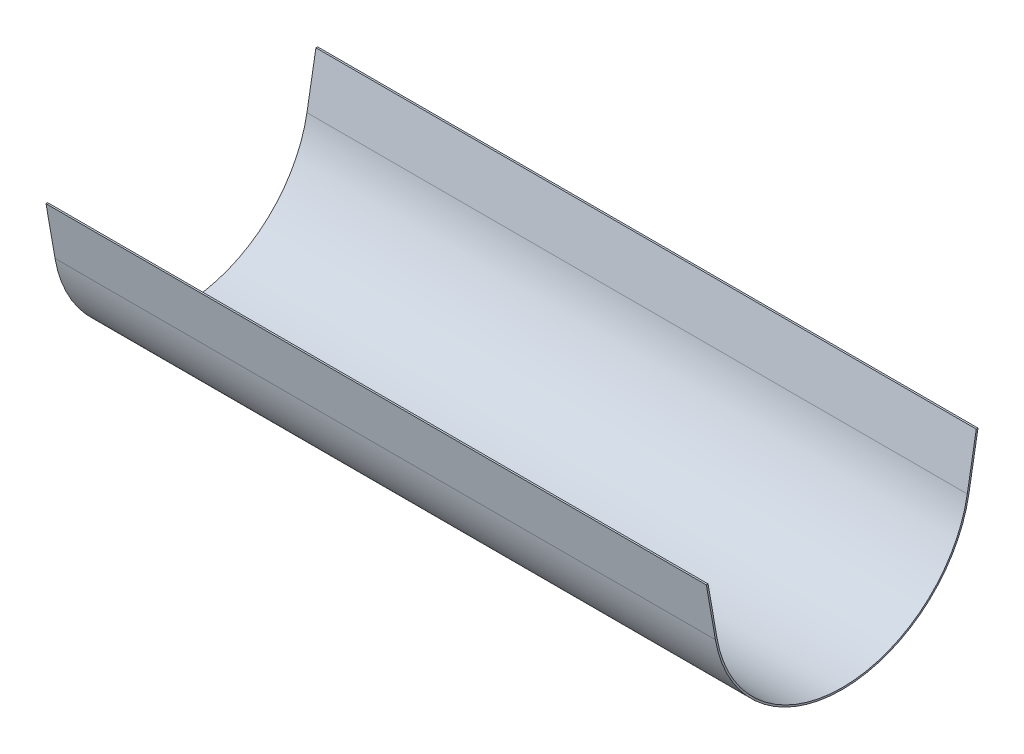
ISO-10303-21;
HEADER;
FILE_DESCRIPTION(('STEP AP214'),'2;1');
FILE_NAME('part.step','',(''),(''),'','','');
FILE_SCHEMA(('AUTOMOTIVE_DESIGN { 1 0 10303 214 1 1 1 1 }'));
ENDSEC;
DATA;
#1=APPLICATION_CONTEXT('core data for automotive mechanical design processes');
#2=APPLICATION_PROTOCOL_DEFINITION('international standard','automotive_design',2000,#1);
#3=PRODUCT_CONTEXT('',#1,'mechanical');
#4=PRODUCT('Part','Part','',(#3));
#5=PRODUCT_RELATED_PRODUCT_CATEGORY('part','',(#4));
#6=PRODUCT_DEFINITION_FORMATION('','',#4);
#7=PRODUCT_DEFINITION_CONTEXT('part definition',#1,'design');
#8=PRODUCT_DEFINITION('design','',#6,#7);
#9=PRODUCT_DEFINITION_SHAPE('','',#8);
#10=(LENGTH_UNIT() NAMED_UNIT(*) SI_UNIT(.MILLI.,.METRE.));
#11=(NAMED_UNIT(*) PLANE_ANGLE_UNIT() SI_UNIT($,.RADIAN.));
#12=(NAMED_UNIT(*) SI_UNIT($,.STERADIAN.) SOLID_ANGLE_UNIT());
#13=UNCERTAINTY_MEASURE_WITH_UNIT(LENGTH_MEASURE(1.E-05),#10,'distance_accuracy_value','');
#14=(GEOMETRIC_REPRESENTATION_CONTEXT(3) GLOBAL_UNCERTAINTY_ASSIGNED_CONTEXT((#13)) GLOBAL_UNIT_ASSIGNED_CONTEXT((#10,
#11,#12)) REPRESENTATION_CONTEXT('',''));
#15=CARTESIAN_POINT('',(0.,0.,0.));
#16=DIRECTION('',(0.,0.,1.));
#17=DIRECTION('',(1.,0.,0.));
#18=AXIS2_PLACEMENT_3D('',#15,#16,#17);
#19=CARTESIAN_POINT('',(195.,0.,-80.21));
#20=DIRECTION('',(0.,-1.,0.));
#21=DIRECTION('',(0.,0.,-1.));
#22=AXIS2_PLACEMENT_3D('',#19,#20,#21);
#23=PLANE('',#22);
#24=DIRECTION('',(0.,0.,1.));
#25=VECTOR('',#24,1.);
#26=CARTESIAN_POINT('',(-195.,0.,-80.21));
#27=LINE('',#26,#25);
#28=CARTESIAN_POINT('',(-195.,0.,-80.21));
#29=VERTEX_POINT('',#28);
#30=CARTESIAN_POINT('',(-195.,0.,-79.1950111024291));
#31=VERTEX_POINT('',#30);
#32=EDGE_CURVE('E139',#29,#31,#27,.T.);
#33=ORIENTED_EDGE('',*,*,#32,.T.);
#34=DIRECTION('',(-1.,0.,0.));
#35=VECTOR('',#34,1.);
#36=CARTESIAN_POINT('',(195.,0.,-79.1950111024291));
#37=LINE('',#36,#35);
#38=CARTESIAN_POINT('',(195.,0.,-79.1950111024291));
#39=VERTEX_POINT('',#38);
#40=EDGE_CURVE('E11',#39,#31,#37,.T.);
#41=ORIENTED_EDGE('',*,*,#40,.F.);
#42=DIRECTION('',(0.,0.,1.));
#43=VECTOR('',#42,1.);
#44=CARTESIAN_POINT('',(195.,0.,-80.21));
#45=LINE('',#44,#43);
#46=CARTESIAN_POINT('',(195.,0.,-80.21));
#47=VERTEX_POINT('',#46);
#48=EDGE_CURVE('E153',#47,#39,#45,.T.);
#49=ORIENTED_EDGE('',*,*,#48,.F.);
#50=DIRECTION('',(-1.,0.,0.));
#51=VECTOR('',#50,1.);
#52=CARTESIAN_POINT('',(195.,0.,-80.21));
#53=LINE('',#52,#51);
#54=EDGE_CURVE('E135',#47,#29,#53,.T.);
#55=ORIENTED_EDGE('',*,*,#54,.T.);
#56=EDGE_LOOP('',(#33,#41,#49,#55));
#57=FACE_BOUND('',#56,.T.);
#58=ADVANCED_FACE('F43',(#57),#23,.F.);
#59=CARTESIAN_POINT('',(195.,0.,-79.1950111024291));
#60=DIRECTION('',(0.,-0.171222125102373,-0.985232451696262));
#61=DIRECTION('',(0.,0.985232451696262,-0.171222125102373));
#62=AXIS2_PLACEMENT_3D('',#59,#60,#61);
#63=PLANE('',#62);
#64=DIRECTION('',(0.,-0.985232451696262,0.171222125102373));
#65=VECTOR('',#64,1.);
#66=CARTESIAN_POINT('',(-195.,0.,-79.1950111024291));
#67=LINE('',#66,#65);
#68=CARTESIAN_POINT('',(-195.,-30.5116593826597,-73.8924338772269));
#69=VERTEX_POINT('',#68);
#70=EDGE_CURVE('E142',#31,#69,#67,.T.);
#71=ORIENTED_EDGE('',*,*,#70,.T.);
#72=DIRECTION('',(-1.,0.,0.));
#73=VECTOR('',#72,1.);
#74=CARTESIAN_POINT('',(195.,-30.5116593826597,-73.8924338772269));
#75=LINE('',#74,#73);
#76=CARTESIAN_POINT('',(195.,-30.5116593826597,-73.8924338772269));
#77=VERTEX_POINT('',#76);
#78=EDGE_CURVE('E51',#77,#69,#75,.T.);
#79=ORIENTED_EDGE('',*,*,#78,.F.);
#80=DIRECTION('',(0.,-0.985232451696262,0.171222125102373));
#81=VECTOR('',#80,1.);
#82=CARTESIAN_POINT('',(195.,0.,-79.1950111024291));
#83=LINE('',#82,#81);
#84=EDGE_CURVE('E102',#39,#77,#83,.T.);
#85=ORIENTED_EDGE('',*,*,#84,.F.);
#86=ORIENTED_EDGE('',*,*,#40,.T.);
#87=EDGE_LOOP('',(#71,#79,#85,#86));
#88=FACE_BOUND('',#87,.T.);
#89=ADVANCED_FACE('F188',(#88),#63,.F.);
#90=CARTESIAN_POINT('',(195.,-17.67,0.));
#91=DIRECTION('',(-1.,0.,0.));
#92=DIRECTION('',(0.,0.,1.));
#93=AXIS2_PLACEMENT_3D('',#90,#91,#92);
#94=CYLINDRICAL_SURFACE('',#93,75.000000000004);
#95=CARTESIAN_POINT('',(-195.,-17.67,0.));
#96=DIRECTION('',(-1.,0.,0.));
#97=DIRECTION('',(0.,0.,-1.));
#98=AXIS2_PLACEMENT_3D('',#95,#96,#97);
#99=CIRCLE('',#98,75.000000000004);
#100=CARTESIAN_POINT('',(-195.,-30.5116593826603,73.8924338772308));
#101=VERTEX_POINT('',#100);
#102=EDGE_CURVE('E144',#69,#101,#99,.T.);
#103=ORIENTED_EDGE('',*,*,#102,.T.);
#104=DIRECTION('',(-1.,0.,0.));
#105=VECTOR('',#104,1.);
#106=CARTESIAN_POINT('',(195.,-30.5116593826603,73.8924338772308));
#107=LINE('',#106,#105);
#108=CARTESIAN_POINT('',(195.,-30.5116593826603,73.8924338772308));
#109=VERTEX_POINT('',#108);
#110=EDGE_CURVE('E160',#109,#101,#107,.T.);
#111=ORIENTED_EDGE('',*,*,#110,.F.);
#112=CARTESIAN_POINT('',(195.,-17.67,0.));
#113=DIRECTION('',(-1.,0.,0.));
#114=DIRECTION('',(0.,0.,-1.));
#115=AXIS2_PLACEMENT_3D('',#112,#113,#114);
#116=CIRCLE('',#115,75.000000000004);
#117=EDGE_CURVE('E168',#77,#109,#116,.T.);
#118=ORIENTED_EDGE('',*,*,#117,.F.);
#119=ORIENTED_EDGE('',*,*,#78,.T.);
#120=EDGE_LOOP('',(#103,#111,#118,#119));
#121=FACE_BOUND('',#120,.T.);
#122=ADVANCED_FACE('F166',(#121),#94,.F.);
#123=CARTESIAN_POINT('',(195.,0.,79.1950111024291));
#124=DIRECTION('',(0.,-0.171222125102119,0.985232451696306));
#125=DIRECTION('',(0.,-0.985232451696306,-0.171222125102119));
#126=AXIS2_PLACEMENT_3D('',#123,#124,#125);
#127=PLANE('',#126);
#128=DIRECTION('',(0.,0.985232451696306,0.171222125102119));
#129=VECTOR('',#128,1.);
#130=CARTESIAN_POINT('',(-195.,0.,79.1950111024291));
#131=LINE('',#130,#129);
#132=CARTESIAN_POINT('',(-195.,0.,79.1950111024291));
#133=VERTEX_POINT('',#132);
#134=EDGE_CURVE('E146',#101,#133,#131,.T.);
#135=ORIENTED_EDGE('',*,*,#134,.T.);
#136=DIRECTION('',(-1.,0.,0.));
#137=VECTOR('',#136,1.);
#138=CARTESIAN_POINT('',(195.,0.,79.1950111024291));
#139=LINE('',#138,#137);
#140=CARTESIAN_POINT('',(195.,0.,79.1950111024291));
#141=VERTEX_POINT('',#140);
#142=EDGE_CURVE('E157',#141,#133,#139,.T.);
#143=ORIENTED_EDGE('',*,*,#142,.F.);
#144=DIRECTION('',(0.,0.985232451696306,0.171222125102119));
#145=VECTOR('',#144,1.);
#146=CARTESIAN_POINT('',(195.,0.,79.1950111024291));
#147=LINE('',#146,#145);
#148=EDGE_CURVE('E180',#109,#141,#147,.T.);
#149=ORIENTED_EDGE('',*,*,#148,.F.);
#150=ORIENTED_EDGE('',*,*,#110,.T.);
#151=EDGE_LOOP('',(#135,#143,#149,#150));
#152=FACE_BOUND('',#151,.T.);
#153=ADVANCED_FACE('F176',(#152),#127,.F.);
#154=CARTESIAN_POINT('',(195.,0.,80.21));
#155=DIRECTION('',(0.,-1.,0.));
#156=DIRECTION('',(0.,0.,-1.));
#157=AXIS2_PLACEMENT_3D('',#154,#155,#156);
#158=PLANE('',#157);
#159=DIRECTION('',(0.,0.,1.));
#160=VECTOR('',#159,1.);
#161=CARTESIAN_POINT('',(-195.,0.,80.21));
#162=LINE('',#161,#160);
#163=CARTESIAN_POINT('',(-195.,0.,80.21));
#164=VERTEX_POINT('',#163);
#165=EDGE_CURVE('E148',#133,#164,#162,.T.);
#166=ORIENTED_EDGE('',*,*,#165,.T.);
#167=DIRECTION('',(-1.,0.,0.));
#168=VECTOR('',#167,1.);
#169=CARTESIAN_POINT('',(195.,0.,80.21));
#170=LINE('',#169,#168);
#171=CARTESIAN_POINT('',(195.,0.,80.21));
#172=VERTEX_POINT('',#171);
#173=EDGE_CURVE('E130',#172,#164,#170,.T.);
#174=ORIENTED_EDGE('',*,*,#173,.F.);
#175=DIRECTION('',(0.,0.,1.));
#176=VECTOR('',#175,1.);
#177=CARTESIAN_POINT('',(195.,0.,80.21));
#178=LINE('',#177,#176);
#179=EDGE_CURVE('E121',#141,#172,#178,.T.);
#180=ORIENTED_EDGE('',*,*,#179,.F.);
#181=ORIENTED_EDGE('',*,*,#142,.T.);
#182=EDGE_LOOP('',(#166,#174,#180,#181));
#183=FACE_BOUND('',#182,.T.);
#184=ADVANCED_FACE('F179',(#183),#158,.F.);
#185=CARTESIAN_POINT('',(195.,0.,80.21));
#186=DIRECTION('',(0.,0.171222125102265,-0.985232451696281));
#187=DIRECTION('',(0.,0.985232451696281,0.171222125102265));
#188=AXIS2_PLACEMENT_3D('',#185,#186,#187);
#189=PLANE('',#188);
#190=DIRECTION('',(0.,-0.985232451696281,-0.171222125102265));
#191=VECTOR('',#190,1.);
#192=CARTESIAN_POINT('',(-195.,0.,80.21));
#193=LINE('',#192,#191);
#194=CARTESIAN_POINT('',(-195.,-30.6828815077613,74.8776663289209));
#195=VERTEX_POINT('',#194);
#196=EDGE_CURVE('E129',#164,#195,#193,.T.);
#197=ORIENTED_EDGE('',*,*,#196,.T.);
#198=DIRECTION('',(-1.,0.,0.));
#199=VECTOR('',#198,1.);
#200=CARTESIAN_POINT('',(195.,-30.6828815077613,74.8776663289209));
#201=LINE('',#200,#199);
#202=CARTESIAN_POINT('',(195.,-30.6828815077613,74.8776663289209));
#203=VERTEX_POINT('',#202);
#204=EDGE_CURVE('E126',#203,#195,#201,.T.);
#205=ORIENTED_EDGE('',*,*,#204,.F.);
#206=DIRECTION('',(0.,-0.985232451696281,-0.171222125102265));
#207=VECTOR('',#206,1.);
#208=CARTESIAN_POINT('',(195.,0.,80.21));
#209=LINE('',#208,#207);
#210=EDGE_CURVE('E115',#172,#203,#209,.T.);
#211=ORIENTED_EDGE('',*,*,#210,.F.);
#212=ORIENTED_EDGE('',*,*,#173,.T.);
#213=EDGE_LOOP('',(#197,#205,#211,#212));
#214=FACE_BOUND('',#213,.T.);
#215=ADVANCED_FACE('F127',(#214),#189,.F.);
#216=CARTESIAN_POINT('',(195.,-17.67,0.));
#217=DIRECTION('',(-1.,0.,0.));
#218=DIRECTION('',(0.,0.,1.));
#219=AXIS2_PLACEMENT_3D('',#216,#217,#218);
#220=CYLINDRICAL_SURFACE('',#219,76.0000000000017);
#221=CARTESIAN_POINT('',(-195.,-17.67,0.));
#222=DIRECTION('',(1.,0.,0.));
#223=DIRECTION('',(0.,0.,-1.));
#224=AXIS2_PLACEMENT_3D('',#221,#222,#223);
#225=CIRCLE('',#224,76.0000000000017);
#226=CARTESIAN_POINT('',(-195.,-30.6828815077614,-74.8776663289209));
#227=VERTEX_POINT('',#226);
#228=EDGE_CURVE('E88',#195,#227,#225,.T.);
#229=ORIENTED_EDGE('',*,*,#228,.T.);
#230=DIRECTION('',(-1.,0.,0.));
#231=VECTOR('',#230,1.);
#232=CARTESIAN_POINT('',(195.,-30.6828815077614,-74.8776663289209));
#233=LINE('',#232,#231);
#234=CARTESIAN_POINT('',(195.,-30.6828815077614,-74.8776663289209));
#235=VERTEX_POINT('',#234);
#236=EDGE_CURVE('E131',#235,#227,#233,.T.);
#237=ORIENTED_EDGE('',*,*,#236,.F.);
#238=CARTESIAN_POINT('',(195.,-17.67,0.));
#239=DIRECTION('',(1.,0.,0.));
#240=DIRECTION('',(0.,0.,-1.));
#241=AXIS2_PLACEMENT_3D('',#238,#239,#240);
#242=CIRCLE('',#241,76.0000000000017);
#243=EDGE_CURVE('E119',#203,#235,#242,.T.);
#244=ORIENTED_EDGE('',*,*,#243,.F.);
#245=ORIENTED_EDGE('',*,*,#204,.T.);
#246=EDGE_LOOP('',(#229,#237,#244,#245));
#247=FACE_BOUND('',#246,.T.);
#248=ADVANCED_FACE('F133',(#247),#220,.T.);
#249=CARTESIAN_POINT('',(195.,0.,-80.21));
#250=DIRECTION('',(0.,0.171222125102264,0.985232451696281));
#251=DIRECTION('',(0.,-0.985232451696281,0.171222125102264));
#252=AXIS2_PLACEMENT_3D('',#249,#250,#251);
#253=PLANE('',#252);
#254=DIRECTION('',(0.,0.985232451696281,-0.171222125102264));
#255=VECTOR('',#254,1.);
#256=CARTESIAN_POINT('',(-195.,0.,-80.21));
#257=LINE('',#256,#255);
#258=EDGE_CURVE('E94',#227,#29,#257,.T.);
#259=ORIENTED_EDGE('',*,*,#258,.T.);
#260=ORIENTED_EDGE('',*,*,#54,.F.);
#261=DIRECTION('',(0.,0.985232451696281,-0.171222125102264));
#262=VECTOR('',#261,1.);
#263=CARTESIAN_POINT('',(195.,0.,-80.21));
#264=LINE('',#263,#262);
#265=EDGE_CURVE('E59',#235,#47,#264,.T.);
#266=ORIENTED_EDGE('',*,*,#265,.F.);
#267=ORIENTED_EDGE('',*,*,#236,.T.);
#268=EDGE_LOOP('',(#259,#260,#266,#267));
#269=FACE_BOUND('',#268,.T.);
#270=ADVANCED_FACE('F204',(#269),#253,.F.);
#271=CARTESIAN_POINT('',(195.,-17.67,0.));
#272=DIRECTION('',(1.,0.,0.));
#273=DIRECTION('',(0.,0.,-1.));
#274=AXIS2_PLACEMENT_3D('',#271,#272,#273);
#275=PLANE('',#274);
#276=ORIENTED_EDGE('',*,*,#48,.T.);
#277=ORIENTED_EDGE('',*,*,#84,.T.);
#278=ORIENTED_EDGE('',*,*,#117,.T.);
#279=ORIENTED_EDGE('',*,*,#148,.T.);
#280=ORIENTED_EDGE('',*,*,#179,.T.);
#281=ORIENTED_EDGE('',*,*,#210,.T.);
#282=ORIENTED_EDGE('',*,*,#243,.T.);
#283=ORIENTED_EDGE('',*,*,#265,.T.);
#284=EDGE_LOOP('',(#276,#277,#278,#279,#280,#281,#282,#283));
#285=FACE_BOUND('',#284,.T.);
#286=ADVANCED_FACE('F117',(#285),#275,.T.);
#287=CARTESIAN_POINT('',(-195.,-17.67,0.));
#288=DIRECTION('',(1.,0.,0.));
#289=DIRECTION('',(0.,0.,-1.));
#290=AXIS2_PLACEMENT_3D('',#287,#288,#289);
#291=PLANE('',#290);
#292=ORIENTED_EDGE('',*,*,#32,.F.);
#293=ORIENTED_EDGE('',*,*,#258,.F.);
#294=ORIENTED_EDGE('',*,*,#228,.F.);
#295=ORIENTED_EDGE('',*,*,#196,.F.);
#296=ORIENTED_EDGE('',*,*,#165,.F.);
#297=ORIENTED_EDGE('',*,*,#134,.F.);
#298=ORIENTED_EDGE('',*,*,#102,.F.);
#299=ORIENTED_EDGE('',*,*,#70,.F.);
#300=EDGE_LOOP('',(#292,#293,#294,#295,#296,#297,#298,#299));
#301=FACE_BOUND('',#300,.T.);
#302=ADVANCED_FACE('F172',(#301),#291,.F.);
#303=CLOSED_SHELL('',(#58,#89,#122,#153,#184,#215,#248,#270,#286,#302));
#304=MANIFOLD_SOLID_BREP('B2',#303);
#305=ADVANCED_BREP_SHAPE_REPRESENTATION('',(#18,#304),#14);
#306=SHAPE_DEFINITION_REPRESENTATION(#9,#305);
ENDSEC;
END-ISO-10303-21;
